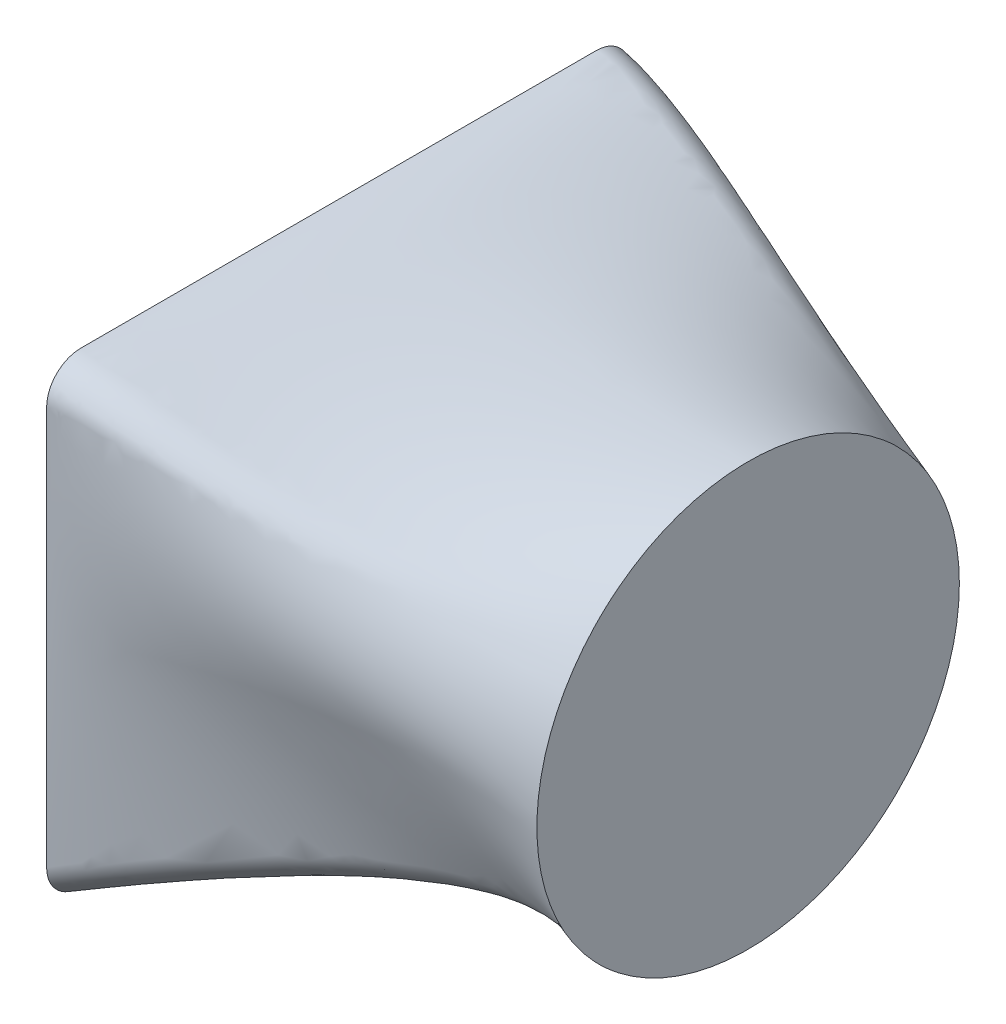
ISO-10303-21;
HEADER;
FILE_DESCRIPTION(('STEP AP214'),'2;1');
FILE_NAME('part.step','',(''),(''),'','','');
FILE_SCHEMA(('AUTOMOTIVE_DESIGN { 1 0 10303 214 1 1 1 1 }'));
ENDSEC;
DATA;
#1=APPLICATION_CONTEXT('core data for automotive mechanical design processes');
#2=APPLICATION_PROTOCOL_DEFINITION('international standard','automotive_design',2000,#1);
#3=PRODUCT_CONTEXT('',#1,'mechanical');
#4=PRODUCT('Part','Part','',(#3));
#5=PRODUCT_RELATED_PRODUCT_CATEGORY('part','',(#4));
#6=PRODUCT_DEFINITION_FORMATION('','',#4);
#7=PRODUCT_DEFINITION_CONTEXT('part definition',#1,'design');
#8=PRODUCT_DEFINITION('design','',#6,#7);
#9=PRODUCT_DEFINITION_SHAPE('','',#8);
#10=(LENGTH_UNIT() NAMED_UNIT(*) SI_UNIT(.MILLI.,.METRE.));
#11=(NAMED_UNIT(*) PLANE_ANGLE_UNIT() SI_UNIT($,.RADIAN.));
#12=(NAMED_UNIT(*) SI_UNIT($,.STERADIAN.) SOLID_ANGLE_UNIT());
#13=UNCERTAINTY_MEASURE_WITH_UNIT(LENGTH_MEASURE(1.E-05),#10,'distance_accuracy_value','');
#14=(GEOMETRIC_REPRESENTATION_CONTEXT(3) GLOBAL_UNCERTAINTY_ASSIGNED_CONTEXT((#13)) GLOBAL_UNIT_ASSIGNED_CONTEXT((#10,
#11,#12)) REPRESENTATION_CONTEXT('',''));
#15=CARTESIAN_POINT('',(0.,0.,0.));
#16=DIRECTION('',(0.,0.,1.));
#17=DIRECTION('',(1.,0.,0.));
#18=AXIS2_PLACEMENT_3D('',#15,#16,#17);
#19=CARTESIAN_POINT('',(76.2,0.,0.));
#20=DIRECTION('',(1.,0.,0.));
#21=DIRECTION('',(0.,0.,-1.));
#22=AXIS2_PLACEMENT_3D('',#19,#20,#21);
#23=PLANE('',#22);
#24=CARTESIAN_POINT('',(76.2,0.,0.));
#25=DIRECTION('',(1.,0.,0.));
#26=DIRECTION('',(0.,0.,-1.));
#27=AXIS2_PLACEMENT_3D('',#24,#25,#26);
#28=CIRCLE('',#27,39.2887280849631);
#29=CARTESIAN_POINT('',(76.2,0.,-39.2887280849631));
#30=VERTEX_POINT('',#29);
#31=EDGE_CURVE('E310',#30,#30,#28,.T.);
#32=ORIENTED_EDGE('',*,*,#31,.T.);
#33=EDGE_LOOP('',(#32));
#34=FACE_BOUND('',#33,.T.);
#35=ADVANCED_FACE('F257',(#34),#23,.T.);
#36=CARTESIAN_POINT('',(0.,37.0604982206406,47.9224031348715));
#37=DIRECTION('',(1.,0.,0.));
#38=DIRECTION('',(0.,0.,-1.));
#39=AXIS2_PLACEMENT_3D('',#36,#37,#38);
#40=PLANE('',#39);
#41=CARTESIAN_POINT('',(0.,37.0604982206406,47.9224031348715));
#42=DIRECTION('',(1.,0.,0.));
#43=DIRECTION('',(0.,0.,-1.));
#44=AXIS2_PLACEMENT_3D('',#41,#42,#43);
#45=CIRCLE('',#44,6.35);
#46=CARTESIAN_POINT('',(0.,43.4104982206406,47.9224031348714));
#47=VERTEX_POINT('',#46);
#48=CARTESIAN_POINT('',(0.,37.0604982206405,54.2724031348715));
#49=VERTEX_POINT('',#48);
#50=EDGE_CURVE('E302',#47,#49,#45,.T.);
#51=ORIENTED_EDGE('',*,*,#50,.F.);
#52=DIRECTION('',(0.,0.,1.));
#53=VECTOR('',#52,1.);
#54=CARTESIAN_POINT('',(0.,43.4104982206406,47.9224031348714));
#55=LINE('',#54,#53);
#56=CARTESIAN_POINT('',(0.,43.4104982206406,-47.9224031348714));
#57=VERTEX_POINT('',#56);
#58=EDGE_CURVE('E13',#57,#47,#55,.T.);
#59=ORIENTED_EDGE('',*,*,#58,.F.);
#60=CARTESIAN_POINT('',(0.,37.0604982206406,-47.9224031348715));
#61=DIRECTION('',(1.,0.,0.));
#62=DIRECTION('',(0.,0.,1.));
#63=AXIS2_PLACEMENT_3D('',#60,#61,#62);
#64=CIRCLE('',#63,6.35);
#65=CARTESIAN_POINT('',(0.,37.0604982206405,-54.2724031348715));
#66=VERTEX_POINT('',#65);
#67=EDGE_CURVE('E266',#66,#57,#64,.T.);
#68=ORIENTED_EDGE('',*,*,#67,.F.);
#69=DIRECTION('',(0.,1.,0.));
#70=VECTOR('',#69,1.);
#71=CARTESIAN_POINT('',(0.,37.0604982206405,-54.2724031348715));
#72=LINE('',#71,#70);
#73=CARTESIAN_POINT('',(0.,-37.0604982206405,-54.2724031348715));
#74=VERTEX_POINT('',#73);
#75=EDGE_CURVE('E383',#74,#66,#72,.T.);
#76=ORIENTED_EDGE('',*,*,#75,.F.);
#77=CARTESIAN_POINT('',(0.,-37.0604982206406,-47.9224031348715));
#78=DIRECTION('',(1.,0.,0.));
#79=DIRECTION('',(0.,0.,-1.));
#80=AXIS2_PLACEMENT_3D('',#77,#78,#79);
#81=CIRCLE('',#80,6.35);
#82=CARTESIAN_POINT('',(0.,-43.4104982206406,-47.9224031348714));
#83=VERTEX_POINT('',#82);
#84=EDGE_CURVE('E379',#83,#74,#81,.T.);
#85=ORIENTED_EDGE('',*,*,#84,.F.);
#86=DIRECTION('',(0.,0.,-1.));
#87=VECTOR('',#86,1.);
#88=CARTESIAN_POINT('',(0.,-43.4104982206406,47.9224031348714));
#89=LINE('',#88,#87);
#90=CARTESIAN_POINT('',(0.,-43.4104982206406,47.9224031348714));
#91=VERTEX_POINT('',#90);
#92=EDGE_CURVE('E374',#91,#83,#89,.T.);
#93=ORIENTED_EDGE('',*,*,#92,.F.);
#94=CARTESIAN_POINT('',(0.,-37.0604982206406,47.9224031348715));
#95=DIRECTION('',(1.,0.,0.));
#96=DIRECTION('',(0.,0.,-1.));
#97=AXIS2_PLACEMENT_3D('',#94,#95,#96);
#98=CIRCLE('',#97,6.35);
#99=CARTESIAN_POINT('',(0.,-37.0604982206405,54.2724031348715));
#100=VERTEX_POINT('',#99);
#101=EDGE_CURVE('E280',#100,#91,#98,.T.);
#102=ORIENTED_EDGE('',*,*,#101,.F.);
#103=DIRECTION('',(0.,-1.,0.));
#104=VECTOR('',#103,1.);
#105=CARTESIAN_POINT('',(0.,37.0604982206405,54.2724031348715));
#106=LINE('',#105,#104);
#107=EDGE_CURVE('E274',#49,#100,#106,.T.);
#108=ORIENTED_EDGE('',*,*,#107,.F.);
#109=EDGE_LOOP('',(#51,#59,#68,#76,#85,#93,#102,#108));
#110=FACE_BOUND('',#109,.T.);
#111=ADVANCED_FACE('F309',(#110),#40,.F.);
#112=CARTESIAN_POINT('',(0.,0.,-54.2724031348715));
#113=CARTESIAN_POINT('',(24.9858993862217,6.60714247970998,-49.3592719375899));
#114=CARTESIAN_POINT('',(51.2141006137783,6.60714247970995,-44.2018592822446));
#115=CARTESIAN_POINT('',(76.2,0.,-39.2887280849631));
#116=CARTESIAN_POINT('',(0.,3.08837485172005,-54.2724031348715));
#117=CARTESIAN_POINT('',(24.2053860757582,9.07651546737158,-50.2387891812433));
#118=CARTESIAN_POINT('',(49.7804301696578,8.07717612930134,-45.4086328499559));
#119=CARTESIAN_POINT('',(76.2,2.02843104149077,-39.2887280849631));
#120=CARTESIAN_POINT('',(0.,9.24876056112611,-54.2724031348714));
#121=CARTESIAN_POINT('',(22.7208597234643,14.0340739252191,-51.6332664419128));
#122=CARTESIAN_POINT('',(47.053622575788,11.1085160210891,-47.2578481868717));
#123=CARTESIAN_POINT('',(76.2000000000002,6.09629611917949,-38.9735947167086));
#124=CARTESIAN_POINT('',(0.,18.4771331024053,-54.2724031348715));
#125=CARTESIAN_POINT('',(20.7235970619999,21.4941379914809,-52.7087444407455));
#126=CARTESIAN_POINT('',(43.3850513579069,15.8270478793768,-48.4450652008599));
#127=CARTESIAN_POINT('',(76.1999999999998,12.0591959322283,-37.5587361819361));
#128=CARTESIAN_POINT('',(0.,27.7296544080765,-54.2724031348715));
#129=CARTESIAN_POINT('',(18.9558873285896,28.9462633959368,-52.8583894716766));
#130=CARTESIAN_POINT('',(40.1381606027605,20.617429226684,-48.1780079006583));
#131=CARTESIAN_POINT('',(76.2000000000002,17.7154915786453,-35.2438741967354));
#132=CARTESIAN_POINT('',(0.,33.9389556953644,-54.2724031348715));
#133=CARTESIAN_POINT('',(17.9304668324033,33.8915504981154,-52.4089341770572));
#134=CARTESIAN_POINT('',(38.2547139343588,23.7990619832985,-47.1341413702225));
#135=CARTESIAN_POINT('',(76.2,21.1797301287033,-33.1519340691669));
#136=CARTESIAN_POINT('',(0.,37.8585435981542,-54.2724031348715));
#137=CARTESIAN_POINT('',(17.3347293050115,36.9857242002366,-51.97778386869));
#138=CARTESIAN_POINT('',(37.1604966409976,25.7775511205897,-46.2437072173568));
#139=CARTESIAN_POINT('',(76.2,23.2313253804833,-31.6886875530413));
#140=CARTESIAN_POINT('',(0.,39.5064420785594,-53.9658209917432));
#141=CARTESIAN_POINT('',(17.0971421116255,38.2683793122649,-51.5890751723488));
#142=CARTESIAN_POINT('',(36.7241105736226,26.579200171356,-45.7679612967215));
#143=CARTESIAN_POINT('',(76.2000000000001,24.0260696037278,-31.0975072884479));
#144=CARTESIAN_POINT('',(0.,41.6814245493819,-52.5306157434974));
#145=CARTESIAN_POINT('',(16.755768902868,39.9769328711472,-50.3209862148158));
#146=CARTESIAN_POINT('',(36.0970987409931,27.6549948635699,-44.6784492146156));
#147=CARTESIAN_POINT('',(76.1999999999999,25.150302393036,-30.1952670452211));
#148=CARTESIAN_POINT('',(0.,43.1077179397641,-50.3556400581003));
#149=CARTESIAN_POINT('',(16.4294037109112,41.1807385203856,-48.5174985565786));
#150=CARTESIAN_POINT('',(35.4976548500373,28.4772971077069,-43.2759266920489));
#151=CARTESIAN_POINT('',(76.2000000000001,26.2423428688251,-29.2514878243097));
#152=CARTESIAN_POINT('',(0.,43.4104982206406,-48.7157156315884));
#153=CARTESIAN_POINT('',(16.2218325511265,41.5546033548147,-47.1543819456359));
#154=CARTESIAN_POINT('',(35.1164046660092,28.8211123843446,-42.2207402731874));
#155=CARTESIAN_POINT('',(76.2,26.9702991673937,-28.5740008829305));
#156=CARTESIAN_POINT('',(0.,43.4104982206406,-43.909919263107));
#157=CARTESIAN_POINT('',(15.6082650697079,42.0942804729638,-43.0658563175728));
#158=CARTESIAN_POINT('',(33.989454933544,29.6015224551802,-38.9603078581356));
#159=CARTESIAN_POINT('',(76.2,29.2157565503725,-26.3980881189534));
#160=CARTESIAN_POINT('',(0.,43.4104982206406,-35.8992635430478));
#161=CARTESIAN_POINT('',(14.7116851267816,42.9201364564628,-35.9008490584967));
#162=CARTESIAN_POINT('',(32.3427102987829,30.8164173837482,-32.9658247672718));
#163=CARTESIAN_POINT('',(76.2000000000002,32.6086653369102,-22.383228091856));
#164=CARTESIAN_POINT('',(0.,43.4104982206406,-23.9152833846141));
#165=CARTESIAN_POINT('',(13.7508320279923,43.8602537724749,-24.3759181045141));
#166=CARTESIAN_POINT('',(30.5779636850661,32.22857938156,-22.7018962257));
#167=CARTESIAN_POINT('',(76.1999999999996,36.4099315463935,-15.4510396893546));
#168=CARTESIAN_POINT('',(0.,43.4104982206406,-11.9523739990817));
#169=CARTESIAN_POINT('',(13.174052092267,44.4470364186668,-12.3241623721282));
#170=CARTESIAN_POINT('',(29.5186745216235,33.1212516400292,-11.5730708442669));
#171=CARTESIAN_POINT('',(76.2000000000006,38.7590931542551,-7.88734691600504));
#172=CARTESIAN_POINT('',(0.,43.4104982206406,0.));
#173=CARTESIAN_POINT('',(12.9814016670676,44.6463314880634,-0.00626073556805841));
#174=CARTESIAN_POINT('',(29.1649299203004,33.4261550220717,-0.00642560061191741));
#175=CARTESIAN_POINT('',(76.1999999999994,39.5536878400236,0.));
#176=CARTESIAN_POINT('',(0.,43.4104982206406,11.9523739990817));
#177=CARTESIAN_POINT('',(13.1729370998585,44.4465993640323,12.3118399594499));
#178=CARTESIAN_POINT('',(29.5168169929473,33.1202369712884,11.5604265846501));
#179=CARTESIAN_POINT('',(76.2000000000004,38.7590931542553,7.88734691600506));
#180=CARTESIAN_POINT('',(0.,43.4104982206406,23.9152833846141));
#181=CARTESIAN_POINT('',(13.7487147381017,43.8593820629036,24.3641928672092));
#182=CARTESIAN_POINT('',(30.5744228514093,32.2266081972047,22.6898727909045));
#183=CARTESIAN_POINT('',(76.1999999999997,36.4099315463933,15.4510396893546));
#184=CARTESIAN_POINT('',(0.,43.4104982206406,35.8992635430478));
#185=CARTESIAN_POINT('',(14.708790929261,42.9188348913503,35.8901191134807));
#186=CARTESIAN_POINT('',(32.337834607536,30.8136059900323,32.9548360405118));
#187=CARTESIAN_POINT('',(76.2000000000002,32.6086653369104,22.383228091856));
#188=CARTESIAN_POINT('',(0.,43.4104982206406,43.909919263107));
#189=CARTESIAN_POINT('',(15.6050783236197,42.0926971368858,43.0560553120266));
#190=CARTESIAN_POINT('',(33.984037784628,29.5982672281438,38.9502848588753));
#191=CARTESIAN_POINT('',(76.2,29.2157565503725,26.3980881189534));
#192=CARTESIAN_POINT('',(0.,43.4104982206406,48.7157156315884));
#193=CARTESIAN_POINT('',(16.2185605946827,41.5528531947299,47.1452167121418));
#194=CARTESIAN_POINT('',(35.1108023752693,28.817637799029,42.21137822394));
#195=CARTESIAN_POINT('',(76.2,26.9702991673937,28.5740008829305));
#196=CARTESIAN_POINT('',(0.,43.1077179397641,50.3556400581001));
#197=CARTESIAN_POINT('',(16.426109496032,41.1789334087272,48.5085484095002));
#198=CARTESIAN_POINT('',(35.4920005155203,28.4737531325664,43.2667882471086));
#199=CARTESIAN_POINT('',(76.2,26.2423428688251,29.2514878243097));
#200=CARTESIAN_POINT('',(0.,41.6814245493819,52.5306157434976));
#201=CARTESIAN_POINT('',(16.7524597921238,39.9750457258878,50.3123742596199));
#202=CARTESIAN_POINT('',(36.0913949286783,27.6513563458723,44.6696623546941));
#203=CARTESIAN_POINT('',(76.2,25.150302393036,30.1952670452212));
#204=CARTESIAN_POINT('',(0.,39.5064420785594,53.965820991743));
#205=CARTESIAN_POINT('',(17.0938374677624,38.26641054571,51.5808169712933));
#206=CARTESIAN_POINT('',(36.7183872178584,26.5754771027156,45.7595422003766));
#207=CARTESIAN_POINT('',(76.2,24.0260696037278,31.097507288448));
#208=CARTESIAN_POINT('',(0.,37.8585435981542,54.2724031348715));
#209=CARTESIAN_POINT('',(17.3314411282055,36.9837013067189,51.9697718785676));
#210=CARTESIAN_POINT('',(37.1547811101535,25.773778645353,46.2355440824352));
#211=CARTESIAN_POINT('',(76.2,23.2313253804833,31.6886875530413));
#212=CARTESIAN_POINT('',(0.,33.9389556953644,54.2724031348715));
#213=CARTESIAN_POINT('',(17.9272363703215,33.8893950505838,52.4015395565506));
#214=CARTESIAN_POINT('',(38.2490443275943,23.7951770929243,47.1266200541005));
#215=CARTESIAN_POINT('',(76.2,21.1797301287033,33.151934069167));
#216=CARTESIAN_POINT('',(0.,27.7296544080765,54.2724031348714));
#217=CARTESIAN_POINT('',(18.9528564257847,28.9438991094251,52.852057558088));
#218=CARTESIAN_POINT('',(40.1327305396455,20.6134208228959,48.1715913769671));
#219=CARTESIAN_POINT('',(76.2,17.7154915786452,35.2438741967352));
#220=CARTESIAN_POINT('',(0.,18.4771331024053,54.2724031348715));
#221=CARTESIAN_POINT('',(20.7212405155854,21.4914684320279,52.7042446856512));
#222=CARTESIAN_POINT('',(43.3805603784293,15.8230477229533,48.4405533931375));
#223=CARTESIAN_POINT('',(76.2000000000001,12.0591959322282,37.5587361819362));
#224=CARTESIAN_POINT('',(0.,9.24876056112609,54.2724031348714));
#225=CARTESIAN_POINT('',(22.7196046730689,14.0311081882296,51.6308369434298));
#226=CARTESIAN_POINT('',(47.05073102773,11.1047445257241,47.2554886224399));
#227=CARTESIAN_POINT('',(76.1999999999999,6.09629611917947,38.9735947167085));
#228=CARTESIAN_POINT('',(0.,3.08837485172005,54.2724031348715));
#229=CARTESIAN_POINT('',(24.2051848638981,9.07335908221199,50.2378985859127));
#230=CARTESIAN_POINT('',(49.7790988608154,8.07372194791059,45.4078731325995));
#231=CARTESIAN_POINT('',(76.2,2.02843104149075,39.2887280849631));
#232=CARTESIAN_POINT('',(0.,-3.08837485172005,54.2724031348715));
#233=CARTESIAN_POINT('',(25.7674424513398,4.13442623043777,48.4804823677974));
#234=CARTESIAN_POINT('',(52.6482738239466,5.13406336473917,42.9960083533595));
#235=CARTESIAN_POINT('',(76.2,-2.02843104149078,39.2887280849631));
#236=CARTESIAN_POINT('',(0.,-9.24876056112613,54.2724031348715));
#237=CARTESIAN_POINT('',(27.2530186563936,-0.823291608477836,46.8758890329605));
#238=CARTESIAN_POINT('',(55.3766456428074,2.1030720540277,40.7297811043299));
#239=CARTESIAN_POINT('',(76.2,-6.09629611917949,38.9735947167086));
#240=CARTESIAN_POINT('',(0.,-18.4771331024053,54.2724031348714));
#241=CARTESIAN_POINT('',(29.2513660507529,-8.28352035105806,44.8526558089149));
#242=CARTESIAN_POINT('',(59.0468330552324,-2.6150996419835,37.6648247459117));
#243=CARTESIAN_POINT('',(76.1999999999999,-12.0591959322283,37.5587361819361));
#244=CARTESIAN_POINT('',(0.,-27.7296544080765,54.2724031348715));
#245=CARTESIAN_POINT('',(31.019723765833,-15.7357441274139,43.151238627984));
#246=CARTESIAN_POINT('',(62.2946892687367,-7.40526584088468,34.8576671001745));
#247=CARTESIAN_POINT('',(76.2000000000001,-17.7154915786452,35.2438741967353));
#248=CARTESIAN_POINT('',(0.,-33.9389556953644,54.2724031348715));
#249=CARTESIAN_POINT('',(32.0453206123284,-20.6810580018234,42.1980107598904));
#250=CARTESIAN_POINT('',(64.1783986897558,-10.586840044164,33.1225040375354));
#251=CARTESIAN_POINT('',(76.2,-21.1797301287033,33.151934069167));
#252=CARTESIAN_POINT('',(0.,-37.8585435981542,54.2724031348715));
#253=CARTESIAN_POINT('',(32.6410997626153,-23.7752380228321,41.6479580628242));
#254=CARTESIAN_POINT('',(65.2726779990256,-12.5653153614662,32.0689073519987));
#255=CARTESIAN_POINT('',(76.2,-23.2313253804833,31.6886875530414));
#256=CARTESIAN_POINT('',(0.,-39.5064420785594,53.9658209917431));
#257=CARTESIAN_POINT('',(32.8786967120231,-25.0578946159493,41.2313797461385));
#258=CARTESIAN_POINT('',(65.7090786023561,-13.3669611729549,31.5549176425737));
#259=CARTESIAN_POINT('',(76.2,-24.0260696037278,31.097507288448));
#260=CARTESIAN_POINT('',(0.,-41.6814245493818,52.5306157434975));
#261=CARTESIAN_POINT('',(33.220063865805,-26.7664472556088,39.9805877846355));
#262=CARTESIAN_POINT('',(66.3360814133928,-14.4427578755934,30.4891411784879));
#263=CARTESIAN_POINT('',(76.1999999999999,-25.1503023930359,30.1952670452211));
#264=CARTESIAN_POINT('',(0.,-43.1077179397641,50.3556400581003));
#265=CARTESIAN_POINT('',(33.5464032043351,-27.9702489799667,38.2509545324979));
#266=CARTESIAN_POINT('',(66.9354867841126,-15.2650687038059,29.1879645757131));
#267=CARTESIAN_POINT('',(76.2000000000001,-26.2423428688251,29.2514878243097));
#268=CARTESIAN_POINT('',(0.,-43.4104982206406,48.7157156315884));
#269=CARTESIAN_POINT('',(33.7539445232389,-28.3441092841686,36.9730831213504));
#270=CARTESIAN_POINT('',(67.3166925068091,-15.6088938884676,28.2497549716056));
#271=CARTESIAN_POINT('',(76.2,-26.9702991673937,28.5740008829305));
#272=CARTESIAN_POINT('',(0.,-43.4104982206406,43.909919263107));
#273=CARTESIAN_POINT('',(34.3674034271748,-28.883769918868,33.1947262600179));
#274=CARTESIAN_POINT('',(68.4434804645775,-16.3893400101261,25.4149483332011));
#275=CARTESIAN_POINT('',(76.2,-29.2157565503725,26.3980881189534));
#276=CARTESIAN_POINT('',(0.,-43.4104982206406,35.8992635430478));
#277=CARTESIAN_POINT('',(35.2636484207105,-29.7095750527682,26.9865549559669));
#278=CARTESIAN_POINT('',(70.0897260424924,-17.6043461514502,20.7334731598483));
#279=CARTESIAN_POINT('',(76.1999999999999,-32.6086653369102,22.3832280918559));
#280=CARTESIAN_POINT('',(0.,-43.4104982206406,23.9152833846141));
#281=CARTESIAN_POINT('',(36.2236534029723,-30.6495636138509,17.8844031154183));
#282=CARTESIAN_POINT('',(71.8532090075164,-19.0167897481521,13.7941773744057));
#283=CARTESIAN_POINT('',(76.2000000000001,-36.4099315463935,15.4510396893547));
#284=CARTESIAN_POINT('',(0.,-43.4104982206406,11.9523739990817));
#285=CARTESIAN_POINT('',(36.7993547605428,-31.2361825180925,8.91377661706359));
#286=CARTESIAN_POINT('',(72.9108911466517,-19.9098201253485,6.89339866901007));
#287=CARTESIAN_POINT('',(76.2,-38.759093154255,7.88734691600507));
#288=CARTESIAN_POINT('',(0.,-43.4104982206406,0.));
#289=CARTESIAN_POINT('',(36.9908113767729,-31.4352963520286,0.00617927483329086));
#290=CARTESIAN_POINT('',(73.2628570358585,-20.215119886037,0.00650706134687123));
#291=CARTESIAN_POINT('',(76.2,-39.5536878400238,0.));
#292=CARTESIAN_POINT('',(0.,-43.4104982206406,-11.9523739990817));
#293=CARTESIAN_POINT('',(36.7980821350132,-31.2353829925368,-8.90161712585479));
#294=CARTESIAN_POINT('',(72.9091912510966,-19.9095982138992,-6.88059148792339));
#295=CARTESIAN_POINT('',(76.1999999999998,-38.7590931542551,-7.88734691600498));
#296=CARTESIAN_POINT('',(0.,-43.4104982206406,-23.9152833846141));
#297=CARTESIAN_POINT('',(36.2212259186148,-30.6480019494579,-17.8728407995828));
#298=CARTESIAN_POINT('',(71.8499783683265,-19.0163275585429,-13.7819910181403));
#299=CARTESIAN_POINT('',(76.2000000000003,-36.4099315463934,-15.4510396893546));
#300=CARTESIAN_POINT('',(0.,-43.4104982206406,-35.8992635430478));
#301=CARTESIAN_POINT('',(35.2603016109281,-29.7073260229751,-26.9759879324205));
#302=CARTESIAN_POINT('',(70.0853029635073,-17.6036069502606,-20.7223215116184));
#303=CARTESIAN_POINT('',(76.1999999999998,-32.6086653369103,-22.3832280918559));
#304=CARTESIAN_POINT('',(0.,-43.4104982206406,-43.909919263107));
#305=CARTESIAN_POINT('',(34.3636792671789,-28.8811374189119,-33.1850881759412));
#306=CARTESIAN_POINT('',(68.4386007295691,-16.3883794011283,-25.404762412471));
#307=CARTESIAN_POINT('',(76.2,-29.2157565503725,-26.3980881189534));
#308=CARTESIAN_POINT('',(0.,-43.4104982206406,-48.7157156315884));
#309=CARTESIAN_POINT('',(33.7500884186332,-28.3412769933063,-36.964080809326));
#310=CARTESIAN_POINT('',(67.3116743642311,-15.6077860228363,-28.2402300008883));
#311=CARTESIAN_POINT('',(76.2,-26.9702991673937,-28.5740008829305));
#312=CARTESIAN_POINT('',(0.,-43.1077179397641,-50.3556400581002));
#313=CARTESIAN_POINT('',(33.542509676403,-27.9673526770764,-38.2421673068892));
#314=CARTESIAN_POINT('',(66.9304317626486,-15.2639112643977,-29.178663209303));
#315=CARTESIAN_POINT('',(76.2000000000001,-26.2423428688251,-29.2514878243097));
#316=CARTESIAN_POINT('',(0.,-41.6814245493819,-52.5306157434975));
#317=CARTESIAN_POINT('',(33.2161335268844,-26.7634610693564,-39.9721387509091));
#318=CARTESIAN_POINT('',(66.3309988292543,-14.4415230617791,-30.4801913970966));
#319=CARTESIAN_POINT('',(76.1999999999999,-25.150302393036,-30.1952670452212));
#320=CARTESIAN_POINT('',(0.,-39.5064420785593,-53.9658209917431));
#321=CARTESIAN_POINT('',(32.8747497962703,-25.0548249699558,-41.2232844665528));
#322=CARTESIAN_POINT('',(65.7039975184815,-13.365645829047,-31.546335624759));
#323=CARTESIAN_POINT('',(76.2000000000001,-24.0260696037278,-31.097507288448));
#324=CARTESIAN_POINT('',(0.,-37.8585435981542,-54.2724031348715));
#325=CARTESIAN_POINT('',(32.6371558918489,-23.7721172120536,-41.6401089941715));
#326=CARTESIAN_POINT('',(65.2676181621419,-12.5639441324068,-32.0605812956072));
#327=CARTESIAN_POINT('',(76.2,-23.2313253804833,-31.6886875530414));
#328=CARTESIAN_POINT('',(0.,-33.9389556953644,-54.2724031348715));
#329=CARTESIAN_POINT('',(32.0414022726281,-20.677817274806,-42.1907790608535));
#330=CARTESIAN_POINT('',(64.1734169606097,-10.5853287599892,-33.1148197999436));
#331=CARTESIAN_POINT('',(76.2,-21.1797301287033,-33.151934069167));
#332=CARTESIAN_POINT('',(0.,-27.7296544080765,-54.2724031348714));
#333=CARTESIAN_POINT('',(31.0159585674739,-15.7323481058783,-43.145069635865));
#334=CARTESIAN_POINT('',(62.2899935011759,-7.40351393662558,-34.8510876550136));
#335=CARTESIAN_POINT('',(76.1999999999999,-17.7154915786452,-35.2438741967354));
#336=CARTESIAN_POINT('',(0.,-18.4771331024053,-54.2724031348715));
#337=CARTESIAN_POINT('',(29.2482224593431,-8.28001580038099,-44.8483189752902));
#338=CARTESIAN_POINT('',(59.04312912075,-2.61292568827696,-37.6601500167194));
#339=CARTESIAN_POINT('',(76.2000000000002,-12.0591959322283,-37.5587361819361));
#340=CARTESIAN_POINT('',(0.,-9.24876056112612,-54.2724031348714));
#341=CARTESIAN_POINT('',(27.2509430347544,-0.819820232901206,-46.8736224559471));
#342=CARTESIAN_POINT('',(55.3745746659933,2.10573767122875,-40.7272586184283));
#343=CARTESIAN_POINT('',(76.1999999999998,-6.09629611917947,-38.9735947167085));
#344=CARTESIAN_POINT('',(0.,-3.08837485172005,-54.2724031348715));
#345=CARTESIAN_POINT('',(25.7664126966852,4.13776949204838,-48.4797546939366));
#346=CARTESIAN_POINT('',(52.6477710578989,5.13710883011856,-42.9950857145332));
#347=CARTESIAN_POINT('',(76.2,-2.02843104149077,-39.2887280849631));
#348=CARTESIAN_POINT('',(0.,0.,-54.2724031348715));
#349=CARTESIAN_POINT('',(24.9858993862217,6.60714247970998,-49.3592719375899));
#350=CARTESIAN_POINT('',(51.2141006137783,6.60714247970995,-44.2018592822446));
#351=CARTESIAN_POINT('',(76.2,0.,-39.2887280849631));
#352=B_SPLINE_SURFACE_WITH_KNOTS('',3,3,((#112,#113,#114,#115),(#116,#117,#118,#119),(#120,#121,
#122,#123),(#124,#125,#126,#127),(#128,#129,#130,#131),(#132,#133,#134,#135),(#136,#137,#138,
#139),(#140,#141,#142,#143),(#144,#145,#146,#147),(#148,#149,#150,#151),(#152,#153,#154,#155),
(#156,#157,#158,#159),(#160,#161,#162,#163),(#164,#165,#166,#167),(#168,#169,#170,#171),(#172,
#173,#174,#175),(#176,#177,#178,#179),(#180,#181,#182,#183),(#184,#185,#186,#187),(#188,#189,
#190,#191),(#192,#193,#194,#195),(#196,#197,#198,#199),(#200,#201,#202,#203),(#204,#205,#206,
#207),(#208,#209,#210,#211),(#212,#213,#214,#215),(#216,#217,#218,#219),(#220,#221,#222,#223),
(#224,#225,#226,#227),(#228,#229,#230,#231),(#232,#233,#234,#235),(#236,#237,#238,#239),(#240,
#241,#242,#243),(#244,#245,#246,#247),(#248,#249,#250,#251),(#252,#253,#254,#255),(#256,#257,
#258,#259),(#260,#261,#262,#263),(#264,#265,#266,#267),(#268,#269,#270,#271),(#272,#273,#274,
#275),(#276,#277,#278,#279),(#280,#281,#282,#283),(#284,#285,#286,#287),(#288,#289,#290,#291),
(#292,#293,#294,#295),(#296,#297,#298,#299),(#300,#301,#302,#303),(#304,#305,#306,#307),(#308,
#309,#310,#311),(#312,#313,#314,#315),(#316,#317,#318,#319),(#320,#321,#322,#323),(#324,#325,
#326,#327),(#328,#329,#330,#331),(#332,#333,#334,#335),(#336,#337,#338,#339),(#340,#341,#342,
#343),(#344,#345,#346,#347),(#348,#349,#350,#351)),.UNSPECIFIED.,.T.,.F.,.F.,(4,1,1,1,2,1,1,1,2,
1,1,1,1,1,1,1,2,1,1,1,2,1,1,1,2,1,1,1,2,1,1,1,2,1,1,1,1,1,1,1,2,1,1,1,2,1,1,1,4),(4,4),(0.,
0.0245218902646084,0.0490437805292168,0.0735656707938253,0.0980875610584336,0.10435676326934,
0.110625965480246,0.116895167691153,0.123164369902059,0.154873277426544,0.186582184951029,
0.218291092475515,0.25,0.281708907524485,0.313417815048971,0.345126722573456,0.376835630097941,
0.383104832308848,0.389374034519754,0.39564323673066,0.401912438941566,0.426434329206175,
0.450956219470783,0.475478109735392,0.5,0.524521890264608,0.549043780529217,0.573565670793825,
0.598087561058434,0.60435676326934,0.610625965480246,0.616895167691152,0.623164369902059,
0.654873277426544,0.686582184951029,0.718291092475515,0.75,0.781708907524485,0.813417815048971,
0.845126722573456,0.876835630097941,0.883104832308848,0.889374034519754,0.89564323673066,
0.901912438941566,0.926434329206175,0.950956219470783,0.975478109735392,1.),(0.,1.),.UNSPECIFIED.);
#353=ORIENTED_EDGE('',*,*,#58,.T.);
#354=ORIENTED_EDGE('',*,*,#50,.T.);
#355=ORIENTED_EDGE('',*,*,#107,.T.);
#356=ORIENTED_EDGE('',*,*,#101,.T.);
#357=ORIENTED_EDGE('',*,*,#92,.T.);
#358=ORIENTED_EDGE('',*,*,#84,.T.);
#359=ORIENTED_EDGE('',*,*,#75,.T.);
#360=ORIENTED_EDGE('',*,*,#67,.T.);
#361=EDGE_LOOP('',(#353,#354,#355,#356,#357,#358,#359,#360));
#362=FACE_BOUND('',#361,.T.);
#363=ORIENTED_EDGE('',*,*,#31,.F.);
#364=EDGE_LOOP('',(#363));
#365=FACE_BOUND('',#364,.T.);
#366=ADVANCED_FACE('F300',(#362,#365),#352,.T.);
#367=CLOSED_SHELL('',(#35,#111,#366));
#368=MANIFOLD_SOLID_BREP('B2',#367);
#369=ADVANCED_BREP_SHAPE_REPRESENTATION('',(#18,#368),#14);
#370=SHAPE_DEFINITION_REPRESENTATION(#9,#369);
ENDSEC;
END-ISO-10303-21;
